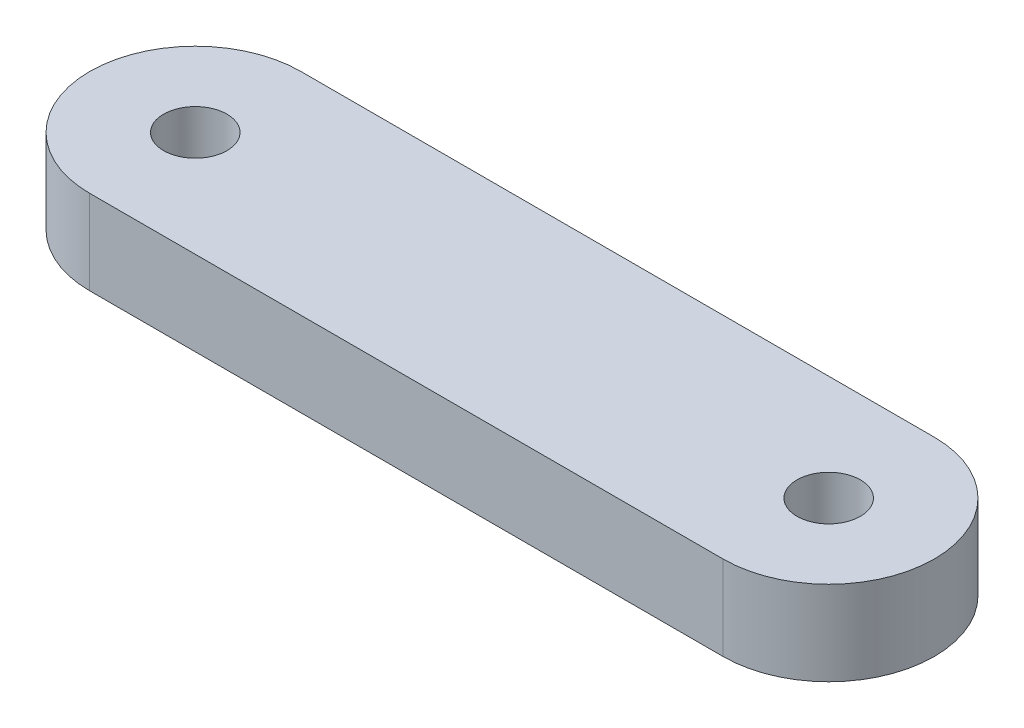
ISO-10303-21;
HEADER;
FILE_DESCRIPTION(('STEP AP214'),'2;1');
FILE_NAME('part.step','',(''),(''),'','','');
FILE_SCHEMA(('AUTOMOTIVE_DESIGN { 1 0 10303 214 1 1 1 1 }'));
ENDSEC;
DATA;
#1=APPLICATION_CONTEXT('core data for automotive mechanical design processes');
#2=APPLICATION_PROTOCOL_DEFINITION('international standard','automotive_design',2000,#1);
#3=PRODUCT_CONTEXT('',#1,'mechanical');
#4=PRODUCT('Part','Part','',(#3));
#5=PRODUCT_RELATED_PRODUCT_CATEGORY('part','',(#4));
#6=PRODUCT_DEFINITION_FORMATION('','',#4);
#7=PRODUCT_DEFINITION_CONTEXT('part definition',#1,'design');
#8=PRODUCT_DEFINITION('design','',#6,#7);
#9=PRODUCT_DEFINITION_SHAPE('','',#8);
#10=(LENGTH_UNIT() NAMED_UNIT(*) SI_UNIT(.MILLI.,.METRE.));
#11=(NAMED_UNIT(*) PLANE_ANGLE_UNIT() SI_UNIT($,.RADIAN.));
#12=(NAMED_UNIT(*) SI_UNIT($,.STERADIAN.) SOLID_ANGLE_UNIT());
#13=UNCERTAINTY_MEASURE_WITH_UNIT(LENGTH_MEASURE(1.E-05),#10,'distance_accuracy_value','');
#14=(GEOMETRIC_REPRESENTATION_CONTEXT(3) GLOBAL_UNCERTAINTY_ASSIGNED_CONTEXT((#13)) GLOBAL_UNIT_ASSIGNED_CONTEXT((#10,
#11,#12)) REPRESENTATION_CONTEXT('',''));
#15=CARTESIAN_POINT('',(0.,0.,0.));
#16=DIRECTION('',(0.,0.,1.));
#17=DIRECTION('',(1.,0.,0.));
#18=AXIS2_PLACEMENT_3D('',#15,#16,#17);
#19=CARTESIAN_POINT('',(300.,80.,0.));
#20=DIRECTION('',(0.,-1.,0.));
#21=DIRECTION('',(0.,0.,-1.));
#22=AXIS2_PLACEMENT_3D('',#19,#20,#21);
#23=CYLINDRICAL_SURFACE('',#22,15.);
#24=CARTESIAN_POINT('',(300.,60.,0.));
#25=DIRECTION('',(0.,-1.,0.));
#26=DIRECTION('',(0.,0.,-1.));
#27=AXIS2_PLACEMENT_3D('',#24,#25,#26);
#28=CIRCLE('',#27,15.);
#29=CARTESIAN_POINT('',(300.,60.,-15.));
#30=VERTEX_POINT('',#29);
#31=EDGE_CURVE('E49',#30,#30,#28,.T.);
#32=ORIENTED_EDGE('',*,*,#31,.F.);
#33=EDGE_LOOP('',(#32));
#34=FACE_BOUND('',#33,.T.);
#35=CARTESIAN_POINT('',(300.,20.,0.));
#36=DIRECTION('',(0.,1.,0.));
#37=DIRECTION('',(0.,0.,1.));
#38=AXIS2_PLACEMENT_3D('',#35,#36,#37);
#39=CIRCLE('',#38,15.);
#40=CARTESIAN_POINT('',(300.,20.,15.));
#41=VERTEX_POINT('',#40);
#42=EDGE_CURVE('E115',#41,#41,#39,.T.);
#43=ORIENTED_EDGE('',*,*,#42,.F.);
#44=EDGE_LOOP('',(#43));
#45=FACE_BOUND('',#44,.T.);
#46=ADVANCED_FACE('F45',(#34,#45),#23,.F.);
#47=CARTESIAN_POINT('',(-100.,20.,-70.));
#48=DIRECTION('',(0.,1.,0.));
#49=DIRECTION('',(0.,0.,1.));
#50=AXIS2_PLACEMENT_3D('',#47,#48,#49);
#51=PLANE('',#50);
#52=CARTESIAN_POINT('',(0.,20.,0.));
#53=DIRECTION('',(0.,1.,0.));
#54=DIRECTION('',(0.,0.,1.));
#55=AXIS2_PLACEMENT_3D('',#52,#53,#54);
#56=CIRCLE('',#55,15.);
#57=CARTESIAN_POINT('',(0.,20.,15.));
#58=VERTEX_POINT('',#57);
#59=EDGE_CURVE('E118',#58,#58,#56,.T.);
#60=ORIENTED_EDGE('',*,*,#59,.T.);
#61=EDGE_LOOP('',(#60));
#62=FACE_BOUND('',#61,.T.);
#63=ORIENTED_EDGE('',*,*,#42,.T.);
#64=EDGE_LOOP('',(#63));
#65=FACE_BOUND('',#64,.T.);
#66=DIRECTION('',(-1.,0.,0.));
#67=VECTOR('',#66,1.);
#68=CARTESIAN_POINT('',(0.,20.,-50.));
#69=LINE('',#68,#67);
#70=CARTESIAN_POINT('',(300.,20.,-50.));
#71=VERTEX_POINT('',#70);
#72=CARTESIAN_POINT('',(0.,20.,-50.));
#73=VERTEX_POINT('',#72);
#74=EDGE_CURVE('E91',#71,#73,#69,.T.);
#75=ORIENTED_EDGE('',*,*,#74,.F.);
#76=CARTESIAN_POINT('',(300.,20.,0.));
#77=DIRECTION('',(0.,1.,0.));
#78=DIRECTION('',(0.,0.,1.));
#79=AXIS2_PLACEMENT_3D('',#76,#77,#78);
#80=CIRCLE('',#79,50.);
#81=CARTESIAN_POINT('',(300.,20.,50.));
#82=VERTEX_POINT('',#81);
#83=EDGE_CURVE('E87',#82,#71,#80,.T.);
#84=ORIENTED_EDGE('',*,*,#83,.F.);
#85=DIRECTION('',(-1.,0.,0.));
#86=VECTOR('',#85,1.);
#87=CARTESIAN_POINT('',(-100.,20.,50.));
#88=LINE('',#87,#86);
#89=CARTESIAN_POINT('',(0.,20.,50.));
#90=VERTEX_POINT('',#89);
#91=EDGE_CURVE('E90',#82,#90,#88,.T.);
#92=ORIENTED_EDGE('',*,*,#91,.T.);
#93=CARTESIAN_POINT('',(0.,20.,0.));
#94=DIRECTION('',(0.,1.,0.));
#95=DIRECTION('',(0.,0.,1.));
#96=AXIS2_PLACEMENT_3D('',#93,#94,#95);
#97=CIRCLE('',#96,50.);
#98=EDGE_CURVE('E71',#73,#90,#97,.T.);
#99=ORIENTED_EDGE('',*,*,#98,.F.);
#100=EDGE_LOOP('',(#75,#84,#92,#99));
#101=FACE_BOUND('',#100,.T.);
#102=ADVANCED_FACE('F89',(#62,#65,#101),#51,.F.);
#103=CARTESIAN_POINT('',(-99.9999999999999,60.,-70.));
#104=DIRECTION('',(0.,-1.,0.));
#105=DIRECTION('',(0.,0.,-1.));
#106=AXIS2_PLACEMENT_3D('',#103,#104,#105);
#107=PLANE('',#106);
#108=CARTESIAN_POINT('',(0.,60.,0.));
#109=DIRECTION('',(0.,-1.,0.));
#110=DIRECTION('',(0.,0.,-1.));
#111=AXIS2_PLACEMENT_3D('',#108,#109,#110);
#112=CIRCLE('',#111,15.);
#113=CARTESIAN_POINT('',(0.,60.,-15.));
#114=VERTEX_POINT('',#113);
#115=EDGE_CURVE('E132',#114,#114,#112,.T.);
#116=ORIENTED_EDGE('',*,*,#115,.T.);
#117=EDGE_LOOP('',(#116));
#118=FACE_BOUND('',#117,.T.);
#119=ORIENTED_EDGE('',*,*,#31,.T.);
#120=EDGE_LOOP('',(#119));
#121=FACE_BOUND('',#120,.T.);
#122=DIRECTION('',(1.,0.,0.));
#123=VECTOR('',#122,1.);
#124=CARTESIAN_POINT('',(-99.9999999999999,60.,50.));
#125=LINE('',#124,#123);
#126=CARTESIAN_POINT('',(0.,60.,50.));
#127=VERTEX_POINT('',#126);
#128=CARTESIAN_POINT('',(300.,60.,50.));
#129=VERTEX_POINT('',#128);
#130=EDGE_CURVE('E104',#127,#129,#125,.T.);
#131=ORIENTED_EDGE('',*,*,#130,.T.);
#132=CARTESIAN_POINT('',(300.,60.,0.));
#133=DIRECTION('',(0.,-1.,0.));
#134=DIRECTION('',(0.,0.,-1.));
#135=AXIS2_PLACEMENT_3D('',#132,#133,#134);
#136=CIRCLE('',#135,50.);
#137=CARTESIAN_POINT('',(300.,60.,-50.));
#138=VERTEX_POINT('',#137);
#139=EDGE_CURVE('E63',#138,#129,#136,.T.);
#140=ORIENTED_EDGE('',*,*,#139,.F.);
#141=DIRECTION('',(1.,0.,0.));
#142=VECTOR('',#141,1.);
#143=CARTESIAN_POINT('',(0.,60.,-50.));
#144=LINE('',#143,#142);
#145=CARTESIAN_POINT('',(0.,60.,-50.));
#146=VERTEX_POINT('',#145);
#147=EDGE_CURVE('E135',#146,#138,#144,.T.);
#148=ORIENTED_EDGE('',*,*,#147,.F.);
#149=CARTESIAN_POINT('',(0.,60.,0.));
#150=DIRECTION('',(0.,-1.,0.));
#151=DIRECTION('',(0.,0.,-1.));
#152=AXIS2_PLACEMENT_3D('',#149,#150,#151);
#153=CIRCLE('',#152,50.);
#154=EDGE_CURVE('E139',#127,#146,#153,.T.);
#155=ORIENTED_EDGE('',*,*,#154,.F.);
#156=EDGE_LOOP('',(#131,#140,#148,#155));
#157=FACE_BOUND('',#156,.T.);
#158=ADVANCED_FACE('F148',(#118,#121,#157),#107,.F.);
#159=CARTESIAN_POINT('',(0.,80.,0.));
#160=DIRECTION('',(0.,-1.,0.));
#161=DIRECTION('',(0.,0.,-1.));
#162=AXIS2_PLACEMENT_3D('',#159,#160,#161);
#163=CYLINDRICAL_SURFACE('',#162,15.);
#164=ORIENTED_EDGE('',*,*,#115,.F.);
#165=EDGE_LOOP('',(#164));
#166=FACE_BOUND('',#165,.T.);
#167=ORIENTED_EDGE('',*,*,#59,.F.);
#168=EDGE_LOOP('',(#167));
#169=FACE_BOUND('',#168,.T.);
#170=ADVANCED_FACE('F150',(#166,#169),#163,.F.);
#171=CARTESIAN_POINT('',(0.,80.,0.));
#172=DIRECTION('',(0.,-1.,0.));
#173=DIRECTION('',(0.,0.,-1.));
#174=AXIS2_PLACEMENT_3D('',#171,#172,#173);
#175=CYLINDRICAL_SURFACE('',#174,50.);
#176=DIRECTION('',(0.,-1.,0.));
#177=VECTOR('',#176,1.);
#178=CARTESIAN_POINT('',(0.,80.,50.));
#179=LINE('',#178,#177);
#180=EDGE_CURVE('E11',#127,#90,#179,.T.);
#181=ORIENTED_EDGE('',*,*,#180,.F.);
#182=ORIENTED_EDGE('',*,*,#154,.T.);
#183=DIRECTION('',(0.,-1.,0.));
#184=VECTOR('',#183,1.);
#185=CARTESIAN_POINT('',(0.,80.,-50.));
#186=LINE('',#185,#184);
#187=EDGE_CURVE('E112',#146,#73,#186,.T.);
#188=ORIENTED_EDGE('',*,*,#187,.T.);
#189=ORIENTED_EDGE('',*,*,#98,.T.);
#190=EDGE_LOOP('',(#181,#182,#188,#189));
#191=FACE_BOUND('',#190,.T.);
#192=ADVANCED_FACE('F47',(#191),#175,.T.);
#193=CARTESIAN_POINT('',(0.,80.,50.));
#194=DIRECTION('',(0.,0.,-1.));
#195=DIRECTION('',(-1.,0.,0.));
#196=AXIS2_PLACEMENT_3D('',#193,#194,#195);
#197=PLANE('',#196);
#198=DIRECTION('',(0.,-1.,0.));
#199=VECTOR('',#198,1.);
#200=CARTESIAN_POINT('',(300.,80.,50.));
#201=LINE('',#200,#199);
#202=EDGE_CURVE('E55',#129,#82,#201,.T.);
#203=ORIENTED_EDGE('',*,*,#202,.F.);
#204=ORIENTED_EDGE('',*,*,#130,.F.);
#205=ORIENTED_EDGE('',*,*,#180,.T.);
#206=ORIENTED_EDGE('',*,*,#91,.F.);
#207=EDGE_LOOP('',(#203,#204,#205,#206));
#208=FACE_BOUND('',#207,.T.);
#209=ADVANCED_FACE('F100',(#208),#197,.F.);
#210=CARTESIAN_POINT('',(300.,80.,0.));
#211=DIRECTION('',(0.,-1.,0.));
#212=DIRECTION('',(0.,0.,-1.));
#213=AXIS2_PLACEMENT_3D('',#210,#211,#212);
#214=CYLINDRICAL_SURFACE('',#213,50.);
#215=DIRECTION('',(0.,-1.,0.));
#216=VECTOR('',#215,1.);
#217=CARTESIAN_POINT('',(300.,80.,-50.));
#218=LINE('',#217,#216);
#219=EDGE_CURVE('E108',#138,#71,#218,.T.);
#220=ORIENTED_EDGE('',*,*,#219,.F.);
#221=ORIENTED_EDGE('',*,*,#139,.T.);
#222=ORIENTED_EDGE('',*,*,#202,.T.);
#223=ORIENTED_EDGE('',*,*,#83,.T.);
#224=EDGE_LOOP('',(#220,#221,#222,#223));
#225=FACE_BOUND('',#224,.T.);
#226=ADVANCED_FACE('F106',(#225),#214,.T.);
#227=CARTESIAN_POINT('',(0.,80.,-50.));
#228=DIRECTION('',(0.,0.,1.));
#229=DIRECTION('',(1.,0.,0.));
#230=AXIS2_PLACEMENT_3D('',#227,#228,#229);
#231=PLANE('',#230);
#232=ORIENTED_EDGE('',*,*,#187,.F.);
#233=ORIENTED_EDGE('',*,*,#147,.T.);
#234=ORIENTED_EDGE('',*,*,#219,.T.);
#235=ORIENTED_EDGE('',*,*,#74,.T.);
#236=EDGE_LOOP('',(#232,#233,#234,#235));
#237=FACE_BOUND('',#236,.T.);
#238=ADVANCED_FACE('F147',(#237),#231,.F.);
#239=CLOSED_SHELL('',(#46,#102,#158,#170,#192,#209,#226,#238));
#240=MANIFOLD_SOLID_BREP('B2',#239);
#241=ADVANCED_BREP_SHAPE_REPRESENTATION('',(#18,#240),#14);
#242=SHAPE_DEFINITION_REPRESENTATION(#9,#241);
ENDSEC;
END-ISO-10303-21;
